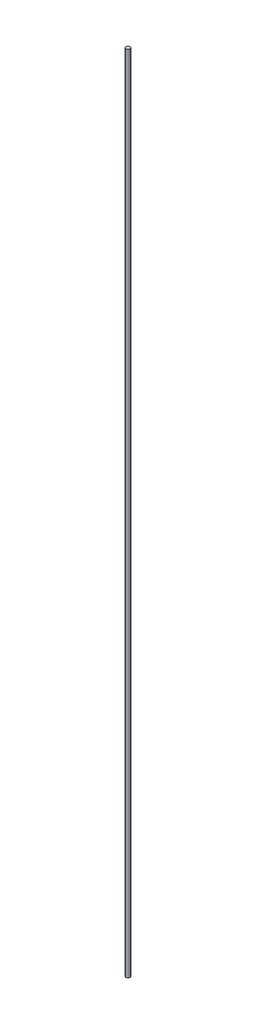
ISO-10303-21;
HEADER;
FILE_DESCRIPTION(('STEP AP214'),'2;1');
FILE_NAME('part.step','',(''),(''),'','','');
FILE_SCHEMA(('AUTOMOTIVE_DESIGN { 1 0 10303 214 1 1 1 1 }'));
ENDSEC;
DATA;
#1=APPLICATION_CONTEXT('core data for automotive mechanical design processes');
#2=APPLICATION_PROTOCOL_DEFINITION('international standard','automotive_design',2000,#1);
#3=PRODUCT_CONTEXT('',#1,'mechanical');
#4=PRODUCT('Part','Part','',(#3));
#5=PRODUCT_RELATED_PRODUCT_CATEGORY('part','',(#4));
#6=PRODUCT_DEFINITION_FORMATION('','',#4);
#7=PRODUCT_DEFINITION_CONTEXT('part definition',#1,'design');
#8=PRODUCT_DEFINITION('design','',#6,#7);
#9=PRODUCT_DEFINITION_SHAPE('','',#8);
#10=(LENGTH_UNIT() NAMED_UNIT(*) SI_UNIT(.MILLI.,.METRE.));
#11=(NAMED_UNIT(*) PLANE_ANGLE_UNIT() SI_UNIT($,.RADIAN.));
#12=(NAMED_UNIT(*) SI_UNIT($,.STERADIAN.) SOLID_ANGLE_UNIT());
#13=UNCERTAINTY_MEASURE_WITH_UNIT(LENGTH_MEASURE(1.E-05),#10,'distance_accuracy_value','');
#14=(GEOMETRIC_REPRESENTATION_CONTEXT(3) GLOBAL_UNCERTAINTY_ASSIGNED_CONTEXT((#13)) GLOBAL_UNIT_ASSIGNED_CONTEXT((#10,
#11,#12)) REPRESENTATION_CONTEXT('',''));
#15=CARTESIAN_POINT('',(0.,0.,0.));
#16=DIRECTION('',(0.,0.,1.));
#17=DIRECTION('',(1.,0.,0.));
#18=AXIS2_PLACEMENT_3D('',#15,#16,#17);
#19=CARTESIAN_POINT('',(0.,300.,0.));
#20=DIRECTION('',(0.,-1.,0.));
#21=DIRECTION('',(0.,0.,-1.));
#22=AXIS2_PLACEMENT_3D('',#19,#20,#21);
#23=CYLINDRICAL_SURFACE('',#22,0.75);
#24=CARTESIAN_POINT('',(0.,300.,0.));
#25=DIRECTION('',(0.,1.,0.));
#26=DIRECTION('',(0.,0.,1.));
#27=AXIS2_PLACEMENT_3D('',#24,#25,#26);
#28=CIRCLE('',#27,0.75);
#29=CARTESIAN_POINT('',(0.,300.,0.75));
#30=VERTEX_POINT('',#29);
#31=EDGE_CURVE('E10',#30,#30,#28,.T.);
#32=ORIENTED_EDGE('',*,*,#31,.F.);
#33=EDGE_LOOP('',(#32));
#34=FACE_BOUND('',#33,.T.);
#35=CARTESIAN_POINT('',(0.,0.,0.));
#36=DIRECTION('',(0.,1.,0.));
#37=DIRECTION('',(0.,0.,1.));
#38=AXIS2_PLACEMENT_3D('',#35,#36,#37);
#39=CIRCLE('',#38,0.75);
#40=CARTESIAN_POINT('',(0.,0.,0.75));
#41=VERTEX_POINT('',#40);
#42=EDGE_CURVE('E34',#41,#41,#39,.T.);
#43=ORIENTED_EDGE('',*,*,#42,.T.);
#44=EDGE_LOOP('',(#43));
#45=FACE_BOUND('',#44,.T.);
#46=ADVANCED_FACE('F31',(#34,#45),#23,.T.);
#47=CARTESIAN_POINT('',(0.,300.,0.));
#48=DIRECTION('',(0.,1.,0.));
#49=DIRECTION('',(0.,0.,1.));
#50=AXIS2_PLACEMENT_3D('',#47,#48,#49);
#51=PLANE('',#50);
#52=ORIENTED_EDGE('',*,*,#31,.T.);
#53=EDGE_LOOP('',(#52));
#54=FACE_BOUND('',#53,.T.);
#55=ADVANCED_FACE('F46',(#54),#51,.T.);
#56=CARTESIAN_POINT('',(0.,0.,0.));
#57=DIRECTION('',(0.,1.,0.));
#58=DIRECTION('',(0.,0.,1.));
#59=AXIS2_PLACEMENT_3D('',#56,#57,#58);
#60=PLANE('',#59);
#61=ORIENTED_EDGE('',*,*,#42,.F.);
#62=EDGE_LOOP('',(#61));
#63=FACE_BOUND('',#62,.T.);
#64=ADVANCED_FACE('F44',(#63),#60,.F.);
#65=CLOSED_SHELL('',(#46,#55,#64));
#66=MANIFOLD_SOLID_BREP('B2',#65);
#67=ADVANCED_BREP_SHAPE_REPRESENTATION('',(#18,#66),#14);
#68=SHAPE_DEFINITION_REPRESENTATION(#9,#67);
ENDSEC;
END-ISO-10303-21;
